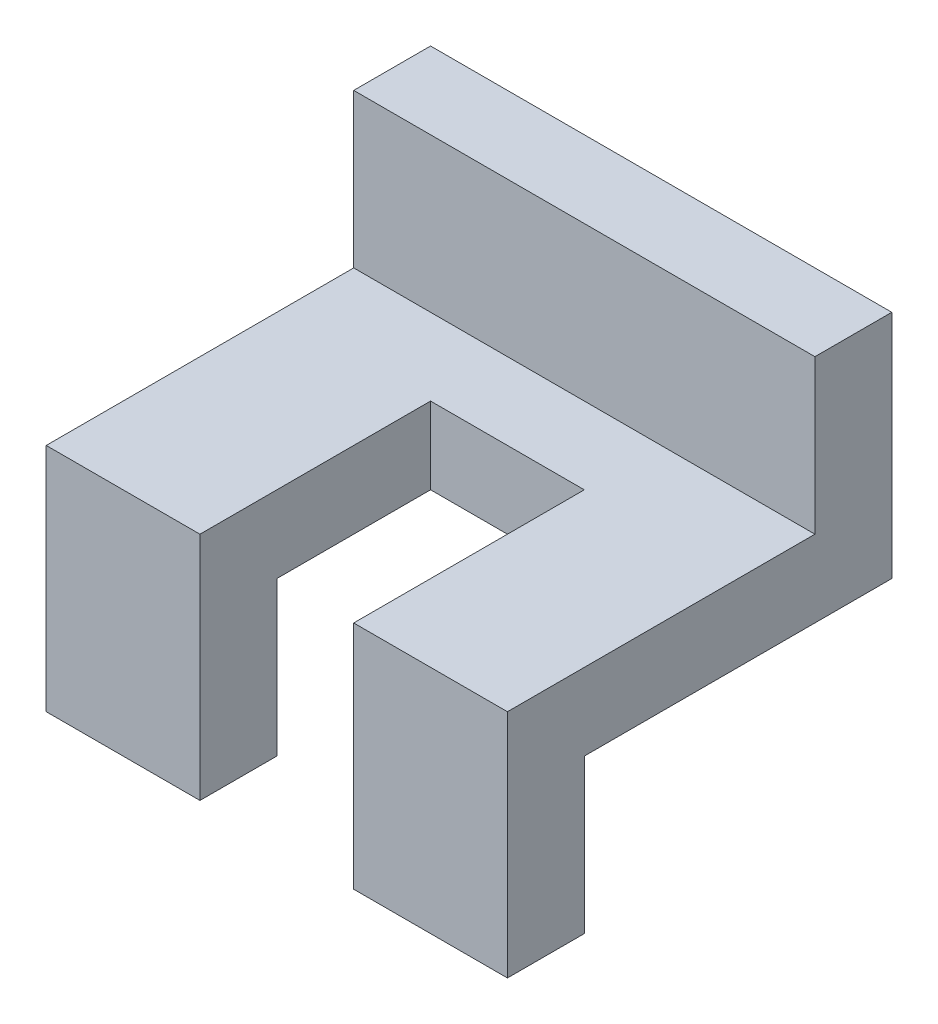
ISO-10303-21;
HEADER;
FILE_DESCRIPTION(('STEP AP214'),'2;1');
FILE_NAME('part.step','',(''),(''),'','','');
FILE_SCHEMA(('AUTOMOTIVE_DESIGN { 1 0 10303 214 1 1 1 1 }'));
ENDSEC;
DATA;
#1=APPLICATION_CONTEXT('core data for automotive mechanical design processes');
#2=APPLICATION_PROTOCOL_DEFINITION('international standard','automotive_design',2000,#1);
#3=PRODUCT_CONTEXT('',#1,'mechanical');
#4=PRODUCT('Part','Part','',(#3));
#5=PRODUCT_RELATED_PRODUCT_CATEGORY('part','',(#4));
#6=PRODUCT_DEFINITION_FORMATION('','',#4);
#7=PRODUCT_DEFINITION_CONTEXT('part definition',#1,'design');
#8=PRODUCT_DEFINITION('design','',#6,#7);
#9=PRODUCT_DEFINITION_SHAPE('','',#8);
#10=(LENGTH_UNIT() NAMED_UNIT(*) SI_UNIT(.MILLI.,.METRE.));
#11=(NAMED_UNIT(*) PLANE_ANGLE_UNIT() SI_UNIT($,.RADIAN.));
#12=(NAMED_UNIT(*) SI_UNIT($,.STERADIAN.) SOLID_ANGLE_UNIT());
#13=UNCERTAINTY_MEASURE_WITH_UNIT(LENGTH_MEASURE(1.E-05),#10,'distance_accuracy_value','');
#14=(GEOMETRIC_REPRESENTATION_CONTEXT(3) GLOBAL_UNCERTAINTY_ASSIGNED_CONTEXT((#13)) GLOBAL_UNIT_ASSIGNED_CONTEXT((#10,
#11,#12)) REPRESENTATION_CONTEXT('',''));
#15=CARTESIAN_POINT('',(0.,0.,0.));
#16=DIRECTION('',(0.,0.,1.));
#17=DIRECTION('',(1.,0.,0.));
#18=AXIS2_PLACEMENT_3D('',#15,#16,#17);
#19=CARTESIAN_POINT('',(19.05,0.,-6.35));
#20=DIRECTION('',(0.,1.,0.));
#21=DIRECTION('',(0.,0.,1.));
#22=AXIS2_PLACEMENT_3D('',#19,#20,#21);
#23=PLANE('',#22);
#24=DIRECTION('',(0.,0.,-1.));
#25=VECTOR('',#24,1.);
#26=CARTESIAN_POINT('',(6.35,0.,0.));
#27=LINE('',#26,#25);
#28=CARTESIAN_POINT('',(6.35,0.,0.));
#29=VERTEX_POINT('',#28);
#30=CARTESIAN_POINT('',(6.35,0.,-6.35));
#31=VERTEX_POINT('',#30);
#32=EDGE_CURVE('E225',#29,#31,#27,.T.);
#33=ORIENTED_EDGE('',*,*,#32,.T.);
#34=DIRECTION('',(-1.,0.,0.));
#35=VECTOR('',#34,1.);
#36=CARTESIAN_POINT('',(19.05,0.,-6.35));
#37=LINE('',#36,#35);
#38=CARTESIAN_POINT('',(19.05,0.,-6.35));
#39=VERTEX_POINT('',#38);
#40=EDGE_CURVE('E205',#39,#31,#37,.T.);
#41=ORIENTED_EDGE('',*,*,#40,.F.);
#42=DIRECTION('',(0.,0.,-1.));
#43=VECTOR('',#42,1.);
#44=CARTESIAN_POINT('',(19.05,0.,-6.35));
#45=LINE('',#44,#43);
#46=CARTESIAN_POINT('',(19.05,0.,0.));
#47=VERTEX_POINT('',#46);
#48=EDGE_CURVE('E181',#47,#39,#45,.T.);
#49=ORIENTED_EDGE('',*,*,#48,.F.);
#50=DIRECTION('',(-1.,0.,0.));
#51=VECTOR('',#50,1.);
#52=CARTESIAN_POINT('',(19.05,0.,0.));
#53=LINE('',#52,#51);
#54=EDGE_CURVE('E182',#47,#29,#53,.T.);
#55=ORIENTED_EDGE('',*,*,#54,.T.);
#56=EDGE_LOOP('',(#33,#41,#49,#55));
#57=FACE_BOUND('',#56,.T.);
#58=ADVANCED_FACE('F39',(#57),#23,.F.);
#59=CARTESIAN_POINT('',(19.05,12.7,-6.35));
#60=DIRECTION('',(0.,0.,1.));
#61=DIRECTION('',(0.,-1.,0.));
#62=AXIS2_PLACEMENT_3D('',#59,#60,#61);
#63=PLANE('',#62);
#64=DIRECTION('',(0.,-1.,0.));
#65=VECTOR('',#64,1.);
#66=CARTESIAN_POINT('',(6.35,12.7,-6.35));
#67=LINE('',#66,#65);
#68=CARTESIAN_POINT('',(6.35,12.7,-6.35));
#69=VERTEX_POINT('',#68);
#70=EDGE_CURVE('E344',#69,#31,#67,.T.);
#71=ORIENTED_EDGE('',*,*,#70,.F.);
#72=DIRECTION('',(-1.,0.,0.));
#73=VECTOR('',#72,1.);
#74=CARTESIAN_POINT('',(19.05,12.7,-6.35));
#75=LINE('',#74,#73);
#76=CARTESIAN_POINT('',(19.05,12.7,-6.35));
#77=VERTEX_POINT('',#76);
#78=EDGE_CURVE('E200',#77,#69,#75,.T.);
#79=ORIENTED_EDGE('',*,*,#78,.F.);
#80=DIRECTION('',(0.,1.,0.));
#81=VECTOR('',#80,1.);
#82=CARTESIAN_POINT('',(19.05,12.7,-6.35));
#83=LINE('',#82,#81);
#84=EDGE_CURVE('E107',#39,#77,#83,.T.);
#85=ORIENTED_EDGE('',*,*,#84,.F.);
#86=ORIENTED_EDGE('',*,*,#40,.T.);
#87=EDGE_LOOP('',(#71,#79,#85,#86));
#88=FACE_BOUND('',#87,.T.);
#89=ADVANCED_FACE('F286',(#88),#63,.F.);
#90=CARTESIAN_POINT('',(19.05,12.7,-31.75));
#91=DIRECTION('',(0.,1.,0.));
#92=DIRECTION('',(0.,0.,1.));
#93=AXIS2_PLACEMENT_3D('',#90,#91,#92);
#94=PLANE('',#93);
#95=DIRECTION('',(0.,0.,1.));
#96=VECTOR('',#95,1.);
#97=CARTESIAN_POINT('',(6.35,12.7,-31.75));
#98=LINE('',#97,#96);
#99=CARTESIAN_POINT('',(6.35,12.7,-19.05));
#100=VERTEX_POINT('',#99);
#101=EDGE_CURVE('E231',#100,#69,#98,.T.);
#102=ORIENTED_EDGE('',*,*,#101,.F.);
#103=DIRECTION('',(-1.,0.,0.));
#104=VECTOR('',#103,1.);
#105=CARTESIAN_POINT('',(19.05,12.7,-19.05));
#106=LINE('',#105,#104);
#107=CARTESIAN_POINT('',(-6.35,12.7,-19.05));
#108=VERTEX_POINT('',#107);
#109=EDGE_CURVE('E160',#100,#108,#106,.T.);
#110=ORIENTED_EDGE('',*,*,#109,.T.);
#111=DIRECTION('',(0.,0.,1.));
#112=VECTOR('',#111,1.);
#113=CARTESIAN_POINT('',(-6.34999999999999,12.7,-31.75));
#114=LINE('',#113,#112);
#115=CARTESIAN_POINT('',(-6.35,12.7,-6.35));
#116=VERTEX_POINT('',#115);
#117=EDGE_CURVE('E327',#108,#116,#114,.T.);
#118=ORIENTED_EDGE('',*,*,#117,.T.);
#119=CARTESIAN_POINT('',(-19.05,12.7,-6.35));
#120=VERTEX_POINT('',#119);
#121=EDGE_CURVE('E199',#116,#120,#75,.T.);
#122=ORIENTED_EDGE('',*,*,#121,.T.);
#123=DIRECTION('',(0.,0.,-1.));
#124=VECTOR('',#123,1.);
#125=CARTESIAN_POINT('',(-19.05,12.7,-31.75));
#126=LINE('',#125,#124);
#127=CARTESIAN_POINT('',(-19.05,12.7,-31.75));
#128=VERTEX_POINT('',#127);
#129=EDGE_CURVE('E164',#120,#128,#126,.T.);
#130=ORIENTED_EDGE('',*,*,#129,.T.);
#131=DIRECTION('',(-1.,0.,0.));
#132=VECTOR('',#131,1.);
#133=CARTESIAN_POINT('',(19.05,12.7,-31.75));
#134=LINE('',#133,#132);
#135=CARTESIAN_POINT('',(19.05,12.7,-31.75));
#136=VERTEX_POINT('',#135);
#137=EDGE_CURVE('E195',#136,#128,#134,.T.);
#138=ORIENTED_EDGE('',*,*,#137,.F.);
#139=DIRECTION('',(0.,0.,-1.));
#140=VECTOR('',#139,1.);
#141=CARTESIAN_POINT('',(19.05,12.7,-31.75));
#142=LINE('',#141,#140);
#143=EDGE_CURVE('E241',#77,#136,#142,.T.);
#144=ORIENTED_EDGE('',*,*,#143,.F.);
#145=ORIENTED_EDGE('',*,*,#78,.T.);
#146=EDGE_LOOP('',(#102,#110,#118,#122,#130,#138,#144,#145));
#147=FACE_BOUND('',#146,.T.);
#148=ADVANCED_FACE('F293',(#147),#94,.F.);
#149=CARTESIAN_POINT('',(19.05,19.05,0.));
#150=DIRECTION('',(0.,-1.,0.));
#151=DIRECTION('',(0.,0.,-1.));
#152=AXIS2_PLACEMENT_3D('',#149,#150,#151);
#153=PLANE('',#152);
#154=DIRECTION('',(0.,0.,-1.));
#155=VECTOR('',#154,1.);
#156=CARTESIAN_POINT('',(6.35,19.05,0.));
#157=LINE('',#156,#155);
#158=CARTESIAN_POINT('',(6.35,19.05,0.));
#159=VERTEX_POINT('',#158);
#160=CARTESIAN_POINT('',(6.35,19.05,-19.05));
#161=VERTEX_POINT('',#160);
#162=EDGE_CURVE('E221',#159,#161,#157,.T.);
#163=ORIENTED_EDGE('',*,*,#162,.F.);
#164=DIRECTION('',(-1.,0.,0.));
#165=VECTOR('',#164,1.);
#166=CARTESIAN_POINT('',(19.05,19.05,0.));
#167=LINE('',#166,#165);
#168=CARTESIAN_POINT('',(19.05,19.05,0.));
#169=VERTEX_POINT('',#168);
#170=EDGE_CURVE('E145',#169,#159,#167,.T.);
#171=ORIENTED_EDGE('',*,*,#170,.F.);
#172=DIRECTION('',(0.,0.,1.));
#173=VECTOR('',#172,1.);
#174=CARTESIAN_POINT('',(19.05,19.05,0.));
#175=LINE('',#174,#173);
#176=CARTESIAN_POINT('',(19.05,19.05,-25.4));
#177=VERTEX_POINT('',#176);
#178=EDGE_CURVE('E126',#177,#169,#175,.T.);
#179=ORIENTED_EDGE('',*,*,#178,.F.);
#180=DIRECTION('',(-1.,0.,0.));
#181=VECTOR('',#180,1.);
#182=CARTESIAN_POINT('',(19.05,19.05,-25.4));
#183=LINE('',#182,#181);
#184=CARTESIAN_POINT('',(-19.05,19.05,-25.4));
#185=VERTEX_POINT('',#184);
#186=EDGE_CURVE('E136',#177,#185,#183,.T.);
#187=ORIENTED_EDGE('',*,*,#186,.T.);
#188=DIRECTION('',(0.,0.,1.));
#189=VECTOR('',#188,1.);
#190=CARTESIAN_POINT('',(-19.05,19.05,0.));
#191=LINE('',#190,#189);
#192=CARTESIAN_POINT('',(-19.05,19.05,0.));
#193=VERTEX_POINT('',#192);
#194=EDGE_CURVE('E175',#185,#193,#191,.T.);
#195=ORIENTED_EDGE('',*,*,#194,.T.);
#196=CARTESIAN_POINT('',(-6.34999999999999,19.05,0.));
#197=VERTEX_POINT('',#196);
#198=EDGE_CURVE('E186',#197,#193,#167,.T.);
#199=ORIENTED_EDGE('',*,*,#198,.F.);
#200=DIRECTION('',(0.,0.,-1.));
#201=VECTOR('',#200,1.);
#202=CARTESIAN_POINT('',(-6.35,19.05,0.));
#203=LINE('',#202,#201);
#204=CARTESIAN_POINT('',(-6.35,19.05,-19.05));
#205=VERTEX_POINT('',#204);
#206=EDGE_CURVE('E55',#197,#205,#203,.T.);
#207=ORIENTED_EDGE('',*,*,#206,.T.);
#208=DIRECTION('',(1.,0.,0.));
#209=VECTOR('',#208,1.);
#210=CARTESIAN_POINT('',(19.05,19.05,-19.05));
#211=LINE('',#210,#209);
#212=EDGE_CURVE('E11',#205,#161,#211,.T.);
#213=ORIENTED_EDGE('',*,*,#212,.T.);
#214=EDGE_LOOP('',(#163,#171,#179,#187,#195,#199,#207,#213));
#215=FACE_BOUND('',#214,.T.);
#216=ADVANCED_FACE('F148',(#215),#153,.F.);
#217=CARTESIAN_POINT('',(19.05,0.,0.));
#218=DIRECTION('',(0.,0.,-1.));
#219=DIRECTION('',(-1.,0.,0.));
#220=AXIS2_PLACEMENT_3D('',#217,#218,#219);
#221=PLANE('',#220);
#222=DIRECTION('',(0.,1.,0.));
#223=VECTOR('',#222,1.);
#224=CARTESIAN_POINT('',(6.35,0.,0.));
#225=LINE('',#224,#223);
#226=EDGE_CURVE('E48',#29,#159,#225,.T.);
#227=ORIENTED_EDGE('',*,*,#226,.F.);
#228=ORIENTED_EDGE('',*,*,#54,.F.);
#229=DIRECTION('',(0.,-1.,0.));
#230=VECTOR('',#229,1.);
#231=CARTESIAN_POINT('',(19.05,0.,0.));
#232=LINE('',#231,#230);
#233=EDGE_CURVE('E64',#169,#47,#232,.T.);
#234=ORIENTED_EDGE('',*,*,#233,.F.);
#235=ORIENTED_EDGE('',*,*,#170,.T.);
#236=EDGE_LOOP('',(#227,#228,#234,#235));
#237=FACE_BOUND('',#236,.T.);
#238=ADVANCED_FACE('F234',(#237),#221,.F.);
#239=CARTESIAN_POINT('',(-6.35,0.,-6.35));
#240=VERTEX_POINT('',#239);
#241=CARTESIAN_POINT('',(-19.05,0.,-6.35));
#242=VERTEX_POINT('',#241);
#243=EDGE_CURVE('E204',#240,#242,#37,.T.);
#244=ORIENTED_EDGE('',*,*,#243,.F.);
#245=DIRECTION('',(0.,0.,-1.));
#246=VECTOR('',#245,1.);
#247=CARTESIAN_POINT('',(-6.35,0.,0.));
#248=LINE('',#247,#246);
#249=CARTESIAN_POINT('',(-6.35,0.,0.));
#250=VERTEX_POINT('',#249);
#251=EDGE_CURVE('E339',#250,#240,#248,.T.);
#252=ORIENTED_EDGE('',*,*,#251,.F.);
#253=CARTESIAN_POINT('',(-19.05,0.,0.));
#254=VERTEX_POINT('',#253);
#255=EDGE_CURVE('E98',#250,#254,#53,.T.);
#256=ORIENTED_EDGE('',*,*,#255,.T.);
#257=DIRECTION('',(0.,0.,-1.));
#258=VECTOR('',#257,1.);
#259=CARTESIAN_POINT('',(-19.05,0.,-6.35));
#260=LINE('',#259,#258);
#261=EDGE_CURVE('E156',#254,#242,#260,.T.);
#262=ORIENTED_EDGE('',*,*,#261,.T.);
#263=EDGE_LOOP('',(#244,#252,#256,#262));
#264=FACE_BOUND('',#263,.T.);
#265=ADVANCED_FACE('F41',(#264),#23,.F.);
#266=ORIENTED_EDGE('',*,*,#121,.F.);
#267=DIRECTION('',(0.,-1.,0.));
#268=VECTOR('',#267,1.);
#269=CARTESIAN_POINT('',(-6.35,12.7,-6.35));
#270=LINE('',#269,#268);
#271=EDGE_CURVE('E232',#116,#240,#270,.T.);
#272=ORIENTED_EDGE('',*,*,#271,.T.);
#273=ORIENTED_EDGE('',*,*,#243,.T.);
#274=DIRECTION('',(0.,1.,0.));
#275=VECTOR('',#274,1.);
#276=CARTESIAN_POINT('',(-19.05,12.7,-6.35));
#277=LINE('',#276,#275);
#278=EDGE_CURVE('E159',#242,#120,#277,.T.);
#279=ORIENTED_EDGE('',*,*,#278,.T.);
#280=EDGE_LOOP('',(#266,#272,#273,#279));
#281=FACE_BOUND('',#280,.T.);
#282=ADVANCED_FACE('F277',(#281),#63,.F.);
#283=CARTESIAN_POINT('',(19.05,31.75,-31.75));
#284=DIRECTION('',(0.,0.,1.));
#285=DIRECTION('',(1.,0.,0.));
#286=AXIS2_PLACEMENT_3D('',#283,#284,#285);
#287=PLANE('',#286);
#288=DIRECTION('',(0.,1.,0.));
#289=VECTOR('',#288,1.);
#290=CARTESIAN_POINT('',(-19.05,31.75,-31.75));
#291=LINE('',#290,#289);
#292=CARTESIAN_POINT('',(-19.05,31.75,-31.75));
#293=VERTEX_POINT('',#292);
#294=EDGE_CURVE('E167',#128,#293,#291,.T.);
#295=ORIENTED_EDGE('',*,*,#294,.T.);
#296=DIRECTION('',(-1.,0.,0.));
#297=VECTOR('',#296,1.);
#298=CARTESIAN_POINT('',(19.05,31.75,-31.75));
#299=LINE('',#298,#297);
#300=CARTESIAN_POINT('',(19.05,31.75,-31.75));
#301=VERTEX_POINT('',#300);
#302=EDGE_CURVE('E191',#301,#293,#299,.T.);
#303=ORIENTED_EDGE('',*,*,#302,.F.);
#304=DIRECTION('',(0.,1.,0.));
#305=VECTOR('',#304,1.);
#306=CARTESIAN_POINT('',(19.05,31.75,-31.75));
#307=LINE('',#306,#305);
#308=EDGE_CURVE('E248',#136,#301,#307,.T.);
#309=ORIENTED_EDGE('',*,*,#308,.F.);
#310=ORIENTED_EDGE('',*,*,#137,.T.);
#311=EDGE_LOOP('',(#295,#303,#309,#310));
#312=FACE_BOUND('',#311,.T.);
#313=ADVANCED_FACE('F256',(#312),#287,.F.);
#314=CARTESIAN_POINT('',(19.05,31.75,-25.4));
#315=DIRECTION('',(0.,-1.,0.));
#316=DIRECTION('',(0.,0.,-1.));
#317=AXIS2_PLACEMENT_3D('',#314,#315,#316);
#318=PLANE('',#317);
#319=DIRECTION('',(0.,0.,1.));
#320=VECTOR('',#319,1.);
#321=CARTESIAN_POINT('',(-19.05,31.75,-25.4));
#322=LINE('',#321,#320);
#323=CARTESIAN_POINT('',(-19.05,31.75,-25.4));
#324=VERTEX_POINT('',#323);
#325=EDGE_CURVE('E170',#293,#324,#322,.T.);
#326=ORIENTED_EDGE('',*,*,#325,.T.);
#327=DIRECTION('',(-1.,0.,0.));
#328=VECTOR('',#327,1.);
#329=CARTESIAN_POINT('',(19.05,31.75,-25.4));
#330=LINE('',#329,#328);
#331=CARTESIAN_POINT('',(19.05,31.75,-25.4));
#332=VERTEX_POINT('',#331);
#333=EDGE_CURVE('E144',#332,#324,#330,.T.);
#334=ORIENTED_EDGE('',*,*,#333,.F.);
#335=DIRECTION('',(0.,0.,1.));
#336=VECTOR('',#335,1.);
#337=CARTESIAN_POINT('',(19.05,31.75,-25.4));
#338=LINE('',#337,#336);
#339=EDGE_CURVE('E129',#301,#332,#338,.T.);
#340=ORIENTED_EDGE('',*,*,#339,.F.);
#341=ORIENTED_EDGE('',*,*,#302,.T.);
#342=EDGE_LOOP('',(#326,#334,#340,#341));
#343=FACE_BOUND('',#342,.T.);
#344=ADVANCED_FACE('F260',(#343),#318,.F.);
#345=CARTESIAN_POINT('',(19.05,19.05,-25.4));
#346=DIRECTION('',(0.,0.,-1.));
#347=DIRECTION('',(-1.,0.,0.));
#348=AXIS2_PLACEMENT_3D('',#345,#346,#347);
#349=PLANE('',#348);
#350=DIRECTION('',(0.,-1.,0.));
#351=VECTOR('',#350,1.);
#352=CARTESIAN_POINT('',(-19.05,19.05,-25.4));
#353=LINE('',#352,#351);
#354=EDGE_CURVE('E139',#324,#185,#353,.T.);
#355=ORIENTED_EDGE('',*,*,#354,.T.);
#356=ORIENTED_EDGE('',*,*,#186,.F.);
#357=DIRECTION('',(0.,-1.,0.));
#358=VECTOR('',#357,1.);
#359=CARTESIAN_POINT('',(19.05,19.05,-25.4));
#360=LINE('',#359,#358);
#361=EDGE_CURVE('E122',#332,#177,#360,.T.);
#362=ORIENTED_EDGE('',*,*,#361,.F.);
#363=ORIENTED_EDGE('',*,*,#333,.T.);
#364=EDGE_LOOP('',(#355,#356,#362,#363));
#365=FACE_BOUND('',#364,.T.);
#366=ADVANCED_FACE('F137',(#365),#349,.F.);
#367=ORIENTED_EDGE('',*,*,#255,.F.);
#368=DIRECTION('',(0.,1.,0.));
#369=VECTOR('',#368,1.);
#370=CARTESIAN_POINT('',(-6.35,0.,0.));
#371=LINE('',#370,#369);
#372=EDGE_CURVE('E208',#250,#197,#371,.T.);
#373=ORIENTED_EDGE('',*,*,#372,.T.);
#374=ORIENTED_EDGE('',*,*,#198,.T.);
#375=DIRECTION('',(0.,-1.,0.));
#376=VECTOR('',#375,1.);
#377=CARTESIAN_POINT('',(-19.05,0.,0.));
#378=LINE('',#377,#376);
#379=EDGE_CURVE('E178',#193,#254,#378,.T.);
#380=ORIENTED_EDGE('',*,*,#379,.T.);
#381=EDGE_LOOP('',(#367,#373,#374,#380));
#382=FACE_BOUND('',#381,.T.);
#383=ADVANCED_FACE('F288',(#382),#221,.F.);
#384=CARTESIAN_POINT('',(19.05,0.,0.));
#385=DIRECTION('',(-1.,0.,0.));
#386=DIRECTION('',(0.,0.,1.));
#387=AXIS2_PLACEMENT_3D('',#384,#385,#386);
#388=PLANE('',#387);
#389=ORIENTED_EDGE('',*,*,#48,.T.);
#390=ORIENTED_EDGE('',*,*,#84,.T.);
#391=ORIENTED_EDGE('',*,*,#143,.T.);
#392=ORIENTED_EDGE('',*,*,#308,.T.);
#393=ORIENTED_EDGE('',*,*,#339,.T.);
#394=ORIENTED_EDGE('',*,*,#361,.T.);
#395=ORIENTED_EDGE('',*,*,#178,.T.);
#396=ORIENTED_EDGE('',*,*,#233,.T.);
#397=EDGE_LOOP('',(#389,#390,#391,#392,#393,#394,#395,#396));
#398=FACE_BOUND('',#397,.T.);
#399=ADVANCED_FACE('F124',(#398),#388,.F.);
#400=CARTESIAN_POINT('',(-19.05,0.,0.));
#401=DIRECTION('',(-1.,0.,0.));
#402=DIRECTION('',(0.,0.,1.));
#403=AXIS2_PLACEMENT_3D('',#400,#401,#402);
#404=PLANE('',#403);
#405=ORIENTED_EDGE('',*,*,#261,.F.);
#406=ORIENTED_EDGE('',*,*,#379,.F.);
#407=ORIENTED_EDGE('',*,*,#194,.F.);
#408=ORIENTED_EDGE('',*,*,#354,.F.);
#409=ORIENTED_EDGE('',*,*,#325,.F.);
#410=ORIENTED_EDGE('',*,*,#294,.F.);
#411=ORIENTED_EDGE('',*,*,#129,.F.);
#412=ORIENTED_EDGE('',*,*,#278,.F.);
#413=EDGE_LOOP('',(#405,#406,#407,#408,#409,#410,#411,#412));
#414=FACE_BOUND('',#413,.T.);
#415=ADVANCED_FACE('F263',(#414),#404,.T.);
#416=CARTESIAN_POINT('',(0.,57.15,-19.05));
#417=DIRECTION('',(0.,0.,-1.));
#418=DIRECTION('',(-1.,0.,0.));
#419=AXIS2_PLACEMENT_3D('',#416,#417,#418);
#420=PLANE('',#419);
#421=DIRECTION('',(0.,-1.,0.));
#422=VECTOR('',#421,1.);
#423=CARTESIAN_POINT('',(6.35,57.15,-19.05));
#424=LINE('',#423,#422);
#425=EDGE_CURVE('E338',#161,#100,#424,.T.);
#426=ORIENTED_EDGE('',*,*,#425,.F.);
#427=ORIENTED_EDGE('',*,*,#212,.F.);
#428=DIRECTION('',(0.,-1.,0.));
#429=VECTOR('',#428,1.);
#430=CARTESIAN_POINT('',(-6.35,57.15,-19.05));
#431=LINE('',#430,#429);
#432=EDGE_CURVE('E329',#205,#108,#431,.T.);
#433=ORIENTED_EDGE('',*,*,#432,.T.);
#434=ORIENTED_EDGE('',*,*,#109,.F.);
#435=EDGE_LOOP('',(#426,#427,#433,#434));
#436=FACE_BOUND('',#435,.T.);
#437=ADVANCED_FACE('F312',(#436),#420,.F.);
#438=CARTESIAN_POINT('',(6.35,57.15,0.));
#439=DIRECTION('',(-1.,0.,0.));
#440=DIRECTION('',(0.,0.,1.));
#441=AXIS2_PLACEMENT_3D('',#438,#439,#440);
#442=PLANE('',#441);
#443=ORIENTED_EDGE('',*,*,#70,.T.);
#444=ORIENTED_EDGE('',*,*,#32,.F.);
#445=ORIENTED_EDGE('',*,*,#226,.T.);
#446=ORIENTED_EDGE('',*,*,#162,.T.);
#447=ORIENTED_EDGE('',*,*,#425,.T.);
#448=ORIENTED_EDGE('',*,*,#101,.T.);
#449=EDGE_LOOP('',(#443,#444,#445,#446,#447,#448));
#450=FACE_BOUND('',#449,.T.);
#451=ADVANCED_FACE('F218',(#450),#442,.T.);
#452=CARTESIAN_POINT('',(-6.35,57.15,0.));
#453=DIRECTION('',(-1.,0.,0.));
#454=DIRECTION('',(0.,0.,1.));
#455=AXIS2_PLACEMENT_3D('',#452,#453,#454);
#456=PLANE('',#455);
#457=ORIENTED_EDGE('',*,*,#117,.F.);
#458=ORIENTED_EDGE('',*,*,#432,.F.);
#459=ORIENTED_EDGE('',*,*,#206,.F.);
#460=ORIENTED_EDGE('',*,*,#372,.F.);
#461=ORIENTED_EDGE('',*,*,#251,.T.);
#462=ORIENTED_EDGE('',*,*,#271,.F.);
#463=EDGE_LOOP('',(#457,#458,#459,#460,#461,#462));
#464=FACE_BOUND('',#463,.T.);
#465=ADVANCED_FACE('F317',(#464),#456,.F.);
#466=CLOSED_SHELL('',(#58,#89,#148,#216,#238,#265,#282,#313,#344,#366,#383,#399,#415,#437,#451,#465));
#467=MANIFOLD_SOLID_BREP('B2',#466);
#468=ADVANCED_BREP_SHAPE_REPRESENTATION('',(#18,#467),#14);
#469=SHAPE_DEFINITION_REPRESENTATION(#9,#468);
ENDSEC;
END-ISO-10303-21;
